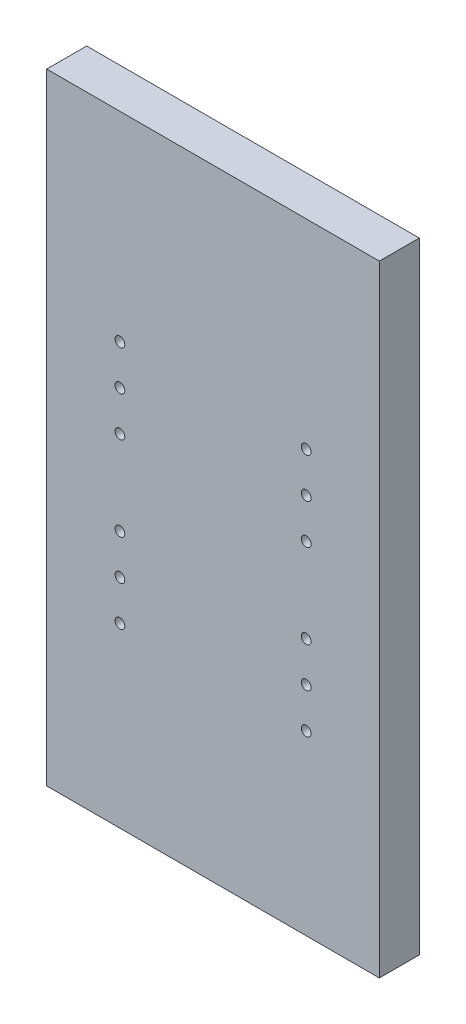
ISO-10303-21;
HEADER;
FILE_DESCRIPTION(('STEP AP214'),'2;1');
FILE_NAME('part.step','',(''),(''),'','','');
FILE_SCHEMA(('AUTOMOTIVE_DESIGN { 1 0 10303 214 1 1 1 1 }'));
ENDSEC;
DATA;
#1=APPLICATION_CONTEXT('core data for automotive mechanical design processes');
#2=APPLICATION_PROTOCOL_DEFINITION('international standard','automotive_design',2000,#1);
#3=PRODUCT_CONTEXT('',#1,'mechanical');
#4=PRODUCT('Part','Part','',(#3));
#5=PRODUCT_RELATED_PRODUCT_CATEGORY('part','',(#4));
#6=PRODUCT_DEFINITION_FORMATION('','',#4);
#7=PRODUCT_DEFINITION_CONTEXT('part definition',#1,'design');
#8=PRODUCT_DEFINITION('design','',#6,#7);
#9=PRODUCT_DEFINITION_SHAPE('','',#8);
#10=(LENGTH_UNIT() NAMED_UNIT(*) SI_UNIT(.MILLI.,.METRE.));
#11=(NAMED_UNIT(*) PLANE_ANGLE_UNIT() SI_UNIT($,.RADIAN.));
#12=(NAMED_UNIT(*) SI_UNIT($,.STERADIAN.) SOLID_ANGLE_UNIT());
#13=UNCERTAINTY_MEASURE_WITH_UNIT(LENGTH_MEASURE(1.E-05),#10,'distance_accuracy_value','');
#14=(GEOMETRIC_REPRESENTATION_CONTEXT(3) GLOBAL_UNCERTAINTY_ASSIGNED_CONTEXT((#13)) GLOBAL_UNIT_ASSIGNED_CONTEXT((#10,
#11,#12)) REPRESENTATION_CONTEXT('',''));
#15=CARTESIAN_POINT('',(0.,0.,0.));
#16=DIRECTION('',(0.,0.,1.));
#17=DIRECTION('',(1.,0.,0.));
#18=AXIS2_PLACEMENT_3D('',#15,#16,#17);
#19=CARTESIAN_POINT('',(0.,0.,18.));
#20=DIRECTION('',(0.,0.,-1.));
#21=DIRECTION('',(-1.,0.,0.));
#22=AXIS2_PLACEMENT_3D('',#19,#20,#21);
#23=PLANE('',#22);
#24=CARTESIAN_POINT('',(263.043137643902,1064.69288200509,18.));
#25=DIRECTION('',(0.,0.,-1.));
#26=DIRECTION('',(-1.,0.,0.));
#27=AXIS2_PLACEMENT_3D('',#24,#25,#26);
#28=CIRCLE('',#27,2.20000000000006);
#29=CARTESIAN_POINT('',(260.843137643902,1064.69288200509,18.));
#30=VERTEX_POINT('',#29);
#31=EDGE_CURVE('E177',#30,#30,#28,.T.);
#32=ORIENTED_EDGE('',*,*,#31,.T.);
#33=EDGE_LOOP('',(#32));
#34=FACE_BOUND('',#33,.T.);
#35=CARTESIAN_POINT('',(263.043137643902,1082.69288200509,18.));
#36=DIRECTION('',(0.,0.,-1.));
#37=DIRECTION('',(-1.,0.,0.));
#38=AXIS2_PLACEMENT_3D('',#35,#36,#37);
#39=CIRCLE('',#38,2.20000000000006);
#40=CARTESIAN_POINT('',(260.843137643902,1082.69288200509,18.));
#41=VERTEX_POINT('',#40);
#42=EDGE_CURVE('E305',#41,#41,#39,.T.);
#43=ORIENTED_EDGE('',*,*,#42,.T.);
#44=EDGE_LOOP('',(#43));
#45=FACE_BOUND('',#44,.T.);
#46=CARTESIAN_POINT('',(179.043137643902,1082.69288200509,18.));
#47=DIRECTION('',(0.,0.,-1.));
#48=DIRECTION('',(-1.,0.,0.));
#49=AXIS2_PLACEMENT_3D('',#46,#47,#48);
#50=CIRCLE('',#49,2.20000000000001);
#51=CARTESIAN_POINT('',(176.843137643902,1082.69288200509,18.));
#52=VERTEX_POINT('',#51);
#53=EDGE_CURVE('E303',#52,#52,#50,.T.);
#54=ORIENTED_EDGE('',*,*,#53,.T.);
#55=EDGE_LOOP('',(#54));
#56=FACE_BOUND('',#55,.T.);
#57=CARTESIAN_POINT('',(179.043137643902,1064.69288200509,18.));
#58=DIRECTION('',(0.,0.,-1.));
#59=DIRECTION('',(-1.,0.,0.));
#60=AXIS2_PLACEMENT_3D('',#57,#58,#59);
#61=CIRCLE('',#60,2.20000000000001);
#62=CARTESIAN_POINT('',(176.843137643902,1064.69288200509,18.));
#63=VERTEX_POINT('',#62);
#64=EDGE_CURVE('E300',#63,#63,#61,.T.);
#65=ORIENTED_EDGE('',*,*,#64,.T.);
#66=EDGE_LOOP('',(#65));
#67=FACE_BOUND('',#66,.T.);
#68=CARTESIAN_POINT('',(179.043137643902,1046.69288200509,18.));
#69=DIRECTION('',(0.,0.,-1.));
#70=DIRECTION('',(-1.,0.,0.));
#71=AXIS2_PLACEMENT_3D('',#68,#69,#70);
#72=CIRCLE('',#71,2.20000000000001);
#73=CARTESIAN_POINT('',(176.843137643902,1046.69288200509,18.));
#74=VERTEX_POINT('',#73);
#75=EDGE_CURVE('E297',#74,#74,#72,.T.);
#76=ORIENTED_EDGE('',*,*,#75,.T.);
#77=EDGE_LOOP('',(#76));
#78=FACE_BOUND('',#77,.T.);
#79=CARTESIAN_POINT('',(179.043137643902,1008.69288200509,18.));
#80=DIRECTION('',(0.,0.,-1.));
#81=DIRECTION('',(-1.,0.,0.));
#82=AXIS2_PLACEMENT_3D('',#79,#80,#81);
#83=CIRCLE('',#82,2.20000000000001);
#84=CARTESIAN_POINT('',(176.843137643902,1008.69288200509,18.));
#85=VERTEX_POINT('',#84);
#86=EDGE_CURVE('E294',#85,#85,#83,.T.);
#87=ORIENTED_EDGE('',*,*,#86,.T.);
#88=EDGE_LOOP('',(#87));
#89=FACE_BOUND('',#88,.T.);
#90=CARTESIAN_POINT('',(179.043137643902,990.692882005094,18.));
#91=DIRECTION('',(0.,0.,-1.));
#92=DIRECTION('',(-1.,0.,0.));
#93=AXIS2_PLACEMENT_3D('',#90,#91,#92);
#94=CIRCLE('',#93,2.19999999999998);
#95=CARTESIAN_POINT('',(176.843137643902,990.692882005094,18.));
#96=VERTEX_POINT('',#95);
#97=EDGE_CURVE('E291',#96,#96,#94,.T.);
#98=ORIENTED_EDGE('',*,*,#97,.T.);
#99=EDGE_LOOP('',(#98));
#100=FACE_BOUND('',#99,.T.);
#101=CARTESIAN_POINT('',(179.043137643902,972.692882005094,18.));
#102=DIRECTION('',(0.,0.,-1.));
#103=DIRECTION('',(-1.,0.,0.));
#104=AXIS2_PLACEMENT_3D('',#101,#102,#103);
#105=CIRCLE('',#104,2.19999999999998);
#106=CARTESIAN_POINT('',(176.843137643902,972.692882005094,18.));
#107=VERTEX_POINT('',#106);
#108=EDGE_CURVE('E288',#107,#107,#105,.T.);
#109=ORIENTED_EDGE('',*,*,#108,.T.);
#110=EDGE_LOOP('',(#109));
#111=FACE_BOUND('',#110,.T.);
#112=CARTESIAN_POINT('',(263.043137643902,972.692882005094,18.));
#113=DIRECTION('',(0.,0.,-1.));
#114=DIRECTION('',(-1.,0.,0.));
#115=AXIS2_PLACEMENT_3D('',#112,#113,#114);
#116=CIRCLE('',#115,2.19999999999998);
#117=CARTESIAN_POINT('',(260.843137643902,972.692882005094,18.));
#118=VERTEX_POINT('',#117);
#119=EDGE_CURVE('E285',#118,#118,#116,.T.);
#120=ORIENTED_EDGE('',*,*,#119,.T.);
#121=EDGE_LOOP('',(#120));
#122=FACE_BOUND('',#121,.T.);
#123=CARTESIAN_POINT('',(263.043137643902,990.692882005094,18.));
#124=DIRECTION('',(0.,0.,-1.));
#125=DIRECTION('',(-1.,0.,0.));
#126=AXIS2_PLACEMENT_3D('',#123,#124,#125);
#127=CIRCLE('',#126,2.19999999999998);
#128=CARTESIAN_POINT('',(260.843137643902,990.692882005094,18.));
#129=VERTEX_POINT('',#128);
#130=EDGE_CURVE('E282',#129,#129,#127,.T.);
#131=ORIENTED_EDGE('',*,*,#130,.T.);
#132=EDGE_LOOP('',(#131));
#133=FACE_BOUND('',#132,.T.);
#134=CARTESIAN_POINT('',(263.043137643902,1008.69288200509,18.));
#135=DIRECTION('',(0.,0.,-1.));
#136=DIRECTION('',(-1.,0.,0.));
#137=AXIS2_PLACEMENT_3D('',#134,#135,#136);
#138=CIRCLE('',#137,2.20000000000001);
#139=CARTESIAN_POINT('',(260.843137643902,1008.69288200509,18.));
#140=VERTEX_POINT('',#139);
#141=EDGE_CURVE('E278',#140,#140,#138,.T.);
#142=ORIENTED_EDGE('',*,*,#141,.T.);
#143=EDGE_LOOP('',(#142));
#144=FACE_BOUND('',#143,.T.);
#145=CARTESIAN_POINT('',(263.043137643902,1046.69288200509,18.));
#146=DIRECTION('',(0.,0.,-1.));
#147=DIRECTION('',(-1.,0.,0.));
#148=AXIS2_PLACEMENT_3D('',#145,#146,#147);
#149=CIRCLE('',#148,2.20000000000006);
#150=CARTESIAN_POINT('',(260.843137643902,1046.69288200509,18.));
#151=VERTEX_POINT('',#150);
#152=EDGE_CURVE('E275',#151,#151,#149,.T.);
#153=ORIENTED_EDGE('',*,*,#152,.T.);
#154=EDGE_LOOP('',(#153));
#155=FACE_BOUND('',#154,.T.);
#156=DIRECTION('',(0.,-1.,0.));
#157=VECTOR('',#156,1.);
#158=CARTESIAN_POINT('',(146.043137643902,1172.69288200509,18.));
#159=LINE('',#158,#157);
#160=CARTESIAN_POINT('',(146.043137643902,1172.69288200509,18.));
#161=VERTEX_POINT('',#160);
#162=CARTESIAN_POINT('',(146.043137643902,892.692882005094,18.));
#163=VERTEX_POINT('',#162);
#164=EDGE_CURVE('E183',#161,#163,#159,.T.);
#165=ORIENTED_EDGE('',*,*,#164,.T.);
#166=DIRECTION('',(1.,0.,0.));
#167=VECTOR('',#166,1.);
#168=CARTESIAN_POINT('',(296.043137643902,892.692882005094,18.));
#169=LINE('',#168,#167);
#170=CARTESIAN_POINT('',(296.043137643902,892.692882005094,18.));
#171=VERTEX_POINT('',#170);
#172=EDGE_CURVE('E229',#163,#171,#169,.T.);
#173=ORIENTED_EDGE('',*,*,#172,.T.);
#174=DIRECTION('',(0.,1.,0.));
#175=VECTOR('',#174,1.);
#176=CARTESIAN_POINT('',(296.043137643902,1172.69288200509,18.));
#177=LINE('',#176,#175);
#178=CARTESIAN_POINT('',(296.043137643902,1172.69288200509,18.));
#179=VERTEX_POINT('',#178);
#180=EDGE_CURVE('E210',#171,#179,#177,.T.);
#181=ORIENTED_EDGE('',*,*,#180,.T.);
#182=DIRECTION('',(-1.,0.,0.));
#183=VECTOR('',#182,1.);
#184=CARTESIAN_POINT('',(296.043137643902,1172.69288200509,18.));
#185=LINE('',#184,#183);
#186=EDGE_CURVE('E204',#179,#161,#185,.T.);
#187=ORIENTED_EDGE('',*,*,#186,.T.);
#188=EDGE_LOOP('',(#165,#173,#181,#187));
#189=FACE_BOUND('',#188,.T.);
#190=ADVANCED_FACE('F174',(#34,#45,#56,#67,#78,#89,#100,#111,#122,#133,#144,#155,#189),#23,.F.);
#191=CARTESIAN_POINT('',(0.,0.,0.));
#192=DIRECTION('',(0.,0.,-1.));
#193=DIRECTION('',(-1.,0.,0.));
#194=AXIS2_PLACEMENT_3D('',#191,#192,#193);
#195=PLANE('',#194);
#196=DIRECTION('',(0.,-1.,0.));
#197=VECTOR('',#196,1.);
#198=CARTESIAN_POINT('',(146.043137643902,1172.69288200509,0.));
#199=LINE('',#198,#197);
#200=CARTESIAN_POINT('',(146.043137643902,1172.69288200509,0.));
#201=VERTEX_POINT('',#200);
#202=CARTESIAN_POINT('',(146.043137643902,892.692882005094,0.));
#203=VERTEX_POINT('',#202);
#204=EDGE_CURVE('E12',#201,#203,#199,.T.);
#205=ORIENTED_EDGE('',*,*,#204,.F.);
#206=DIRECTION('',(-1.,0.,0.));
#207=VECTOR('',#206,1.);
#208=CARTESIAN_POINT('',(296.043137643902,1172.69288200509,0.));
#209=LINE('',#208,#207);
#210=CARTESIAN_POINT('',(296.043137643902,1172.69288200509,0.));
#211=VERTEX_POINT('',#210);
#212=EDGE_CURVE('E236',#211,#201,#209,.T.);
#213=ORIENTED_EDGE('',*,*,#212,.F.);
#214=DIRECTION('',(0.,1.,0.));
#215=VECTOR('',#214,1.);
#216=CARTESIAN_POINT('',(296.043137643902,1172.69288200509,0.));
#217=LINE('',#216,#215);
#218=CARTESIAN_POINT('',(296.043137643902,892.692882005094,0.));
#219=VERTEX_POINT('',#218);
#220=EDGE_CURVE('E221',#219,#211,#217,.T.);
#221=ORIENTED_EDGE('',*,*,#220,.F.);
#222=DIRECTION('',(1.,0.,0.));
#223=VECTOR('',#222,1.);
#224=CARTESIAN_POINT('',(296.043137643902,892.692882005094,0.));
#225=LINE('',#224,#223);
#226=EDGE_CURVE('E217',#203,#219,#225,.T.);
#227=ORIENTED_EDGE('',*,*,#226,.F.);
#228=EDGE_LOOP('',(#205,#213,#221,#227));
#229=FACE_BOUND('',#228,.T.);
#230=ADVANCED_FACE('F219',(#229),#195,.T.);
#231=CARTESIAN_POINT('',(296.043137643902,1172.69288200509,0.));
#232=DIRECTION('',(0.,1.,0.));
#233=DIRECTION('',(-1.,0.,0.));
#234=AXIS2_PLACEMENT_3D('',#231,#232,#233);
#235=PLANE('',#234);
#236=ORIENTED_EDGE('',*,*,#186,.F.);
#237=DIRECTION('',(0.,0.,1.));
#238=VECTOR('',#237,1.);
#239=CARTESIAN_POINT('',(296.043137643902,1172.69288200509,0.));
#240=LINE('',#239,#238);
#241=EDGE_CURVE('E240',#211,#179,#240,.T.);
#242=ORIENTED_EDGE('',*,*,#241,.F.);
#243=ORIENTED_EDGE('',*,*,#212,.T.);
#244=DIRECTION('',(0.,0.,1.));
#245=VECTOR('',#244,1.);
#246=CARTESIAN_POINT('',(146.043137643902,1172.69288200509,0.));
#247=LINE('',#246,#245);
#248=EDGE_CURVE('E233',#201,#161,#247,.T.);
#249=ORIENTED_EDGE('',*,*,#248,.T.);
#250=EDGE_LOOP('',(#236,#242,#243,#249));
#251=FACE_BOUND('',#250,.T.);
#252=ADVANCED_FACE('F239',(#251),#235,.T.);
#253=CARTESIAN_POINT('',(296.043137643902,1172.69288200509,0.));
#254=DIRECTION('',(1.,0.,0.));
#255=DIRECTION('',(0.,0.,-1.));
#256=AXIS2_PLACEMENT_3D('',#253,#254,#255);
#257=PLANE('',#256);
#258=ORIENTED_EDGE('',*,*,#180,.F.);
#259=DIRECTION('',(0.,0.,1.));
#260=VECTOR('',#259,1.);
#261=CARTESIAN_POINT('',(296.043137643902,892.692882005094,0.));
#262=LINE('',#261,#260);
#263=EDGE_CURVE('E263',#219,#171,#262,.T.);
#264=ORIENTED_EDGE('',*,*,#263,.F.);
#265=ORIENTED_EDGE('',*,*,#220,.T.);
#266=ORIENTED_EDGE('',*,*,#241,.T.);
#267=EDGE_LOOP('',(#258,#264,#265,#266));
#268=FACE_BOUND('',#267,.T.);
#269=ADVANCED_FACE('F340',(#268),#257,.T.);
#270=CARTESIAN_POINT('',(296.043137643902,892.692882005094,0.));
#271=DIRECTION('',(0.,-1.,0.));
#272=DIRECTION('',(1.,0.,0.));
#273=AXIS2_PLACEMENT_3D('',#270,#271,#272);
#274=PLANE('',#273);
#275=ORIENTED_EDGE('',*,*,#172,.F.);
#276=DIRECTION('',(0.,0.,1.));
#277=VECTOR('',#276,1.);
#278=CARTESIAN_POINT('',(146.043137643902,892.692882005094,0.));
#279=LINE('',#278,#277);
#280=EDGE_CURVE('E225',#203,#163,#279,.T.);
#281=ORIENTED_EDGE('',*,*,#280,.F.);
#282=ORIENTED_EDGE('',*,*,#226,.T.);
#283=ORIENTED_EDGE('',*,*,#263,.T.);
#284=EDGE_LOOP('',(#275,#281,#282,#283));
#285=FACE_BOUND('',#284,.T.);
#286=ADVANCED_FACE('F228',(#285),#274,.T.);
#287=CARTESIAN_POINT('',(146.043137643902,1172.69288200509,0.));
#288=DIRECTION('',(-1.,0.,0.));
#289=DIRECTION('',(0.,0.,1.));
#290=AXIS2_PLACEMENT_3D('',#287,#288,#289);
#291=PLANE('',#290);
#292=ORIENTED_EDGE('',*,*,#164,.F.);
#293=ORIENTED_EDGE('',*,*,#248,.F.);
#294=ORIENTED_EDGE('',*,*,#204,.T.);
#295=ORIENTED_EDGE('',*,*,#280,.T.);
#296=EDGE_LOOP('',(#292,#293,#294,#295));
#297=FACE_BOUND('',#296,.T.);
#298=ADVANCED_FACE('F232',(#297),#291,.T.);
#299=CARTESIAN_POINT('',(263.043137643902,1046.69288200509,20.9999999999988));
#300=DIRECTION('',(0.,0.,-1.));
#301=DIRECTION('',(-1.,0.,0.));
#302=AXIS2_PLACEMENT_3D('',#299,#300,#301);
#303=CYLINDRICAL_SURFACE('',#302,2.20000000000006);
#304=CARTESIAN_POINT('',(263.043137643902,1046.69288200509,2.9999999999988));
#305=DIRECTION('',(0.,0.,-1.));
#306=DIRECTION('',(-1.,0.,0.));
#307=AXIS2_PLACEMENT_3D('',#304,#305,#306);
#308=CIRCLE('',#307,2.20000000000006);
#309=CARTESIAN_POINT('',(260.843137643902,1046.69288200509,2.9999999999988));
#310=VERTEX_POINT('',#309);
#311=EDGE_CURVE('E279',#310,#310,#308,.T.);
#312=ORIENTED_EDGE('',*,*,#311,.T.);
#313=EDGE_LOOP('',(#312));
#314=FACE_BOUND('',#313,.T.);
#315=ORIENTED_EDGE('',*,*,#152,.F.);
#316=EDGE_LOOP('',(#315));
#317=FACE_BOUND('',#316,.T.);
#318=ADVANCED_FACE('F331',(#314,#317),#303,.F.);
#319=CARTESIAN_POINT('',(0.,0.,2.99999999999881));
#320=DIRECTION('',(0.,0.,-1.));
#321=DIRECTION('',(-1.,0.,0.));
#322=AXIS2_PLACEMENT_3D('',#319,#320,#321);
#323=PLANE('',#322);
#324=ORIENTED_EDGE('',*,*,#311,.F.);
#325=EDGE_LOOP('',(#324));
#326=FACE_BOUND('',#325,.T.);
#327=ADVANCED_FACE('F337',(#326),#323,.F.);
#328=CARTESIAN_POINT('',(263.043137643902,1008.69288200509,20.9999999999988));
#329=DIRECTION('',(0.,0.,-1.));
#330=DIRECTION('',(-1.,0.,0.));
#331=AXIS2_PLACEMENT_3D('',#328,#329,#330);
#332=CYLINDRICAL_SURFACE('',#331,2.20000000000001);
#333=CARTESIAN_POINT('',(263.043137643902,1008.69288200509,2.9999999999988));
#334=DIRECTION('',(0.,0.,-1.));
#335=DIRECTION('',(-1.,0.,0.));
#336=AXIS2_PLACEMENT_3D('',#333,#334,#335);
#337=CIRCLE('',#336,2.20000000000001);
#338=CARTESIAN_POINT('',(260.843137643902,1008.69288200509,2.9999999999988));
#339=VERTEX_POINT('',#338);
#340=EDGE_CURVE('E641',#339,#339,#337,.T.);
#341=ORIENTED_EDGE('',*,*,#340,.T.);
#342=EDGE_LOOP('',(#341));
#343=FACE_BOUND('',#342,.T.);
#344=ORIENTED_EDGE('',*,*,#141,.F.);
#345=EDGE_LOOP('',(#344));
#346=FACE_BOUND('',#345,.T.);
#347=ADVANCED_FACE('F370',(#343,#346),#332,.F.);
#348=CARTESIAN_POINT('',(0.,0.,2.99999999999881));
#349=DIRECTION('',(0.,0.,-1.));
#350=DIRECTION('',(-1.,0.,0.));
#351=AXIS2_PLACEMENT_3D('',#348,#349,#350);
#352=PLANE('',#351);
#353=ORIENTED_EDGE('',*,*,#340,.F.);
#354=EDGE_LOOP('',(#353));
#355=FACE_BOUND('',#354,.T.);
#356=ADVANCED_FACE('F380',(#355),#352,.F.);
#357=CARTESIAN_POINT('',(263.043137643902,990.692882005094,20.9999999999988));
#358=DIRECTION('',(0.,0.,-1.));
#359=DIRECTION('',(-1.,0.,0.));
#360=AXIS2_PLACEMENT_3D('',#357,#358,#359);
#361=CYLINDRICAL_SURFACE('',#360,2.19999999999998);
#362=CARTESIAN_POINT('',(263.043137643902,990.692882005094,2.9999999999988));
#363=DIRECTION('',(0.,0.,-1.));
#364=DIRECTION('',(-1.,0.,0.));
#365=AXIS2_PLACEMENT_3D('',#362,#363,#364);
#366=CIRCLE('',#365,2.19999999999998);
#367=CARTESIAN_POINT('',(260.843137643902,990.692882005094,2.9999999999988));
#368=VERTEX_POINT('',#367);
#369=EDGE_CURVE('E637',#368,#368,#366,.T.);
#370=ORIENTED_EDGE('',*,*,#369,.T.);
#371=EDGE_LOOP('',(#370));
#372=FACE_BOUND('',#371,.T.);
#373=ORIENTED_EDGE('',*,*,#130,.F.);
#374=EDGE_LOOP('',(#373));
#375=FACE_BOUND('',#374,.T.);
#376=ADVANCED_FACE('F390',(#372,#375),#361,.F.);
#377=CARTESIAN_POINT('',(0.,0.,2.99999999999881));
#378=DIRECTION('',(0.,0.,-1.));
#379=DIRECTION('',(-1.,0.,0.));
#380=AXIS2_PLACEMENT_3D('',#377,#378,#379);
#381=PLANE('',#380);
#382=ORIENTED_EDGE('',*,*,#369,.F.);
#383=EDGE_LOOP('',(#382));
#384=FACE_BOUND('',#383,.T.);
#385=ADVANCED_FACE('F399',(#384),#381,.F.);
#386=CARTESIAN_POINT('',(263.043137643902,972.692882005094,20.9999999999988));
#387=DIRECTION('',(0.,0.,-1.));
#388=DIRECTION('',(-1.,0.,0.));
#389=AXIS2_PLACEMENT_3D('',#386,#387,#388);
#390=CYLINDRICAL_SURFACE('',#389,2.19999999999998);
#391=CARTESIAN_POINT('',(263.043137643902,972.692882005094,2.9999999999988));
#392=DIRECTION('',(0.,0.,-1.));
#393=DIRECTION('',(-1.,0.,0.));
#394=AXIS2_PLACEMENT_3D('',#391,#392,#393);
#395=CIRCLE('',#394,2.19999999999998);
#396=CARTESIAN_POINT('',(260.843137643902,972.692882005094,2.9999999999988));
#397=VERTEX_POINT('',#396);
#398=EDGE_CURVE('E629',#397,#397,#395,.T.);
#399=ORIENTED_EDGE('',*,*,#398,.T.);
#400=EDGE_LOOP('',(#399));
#401=FACE_BOUND('',#400,.T.);
#402=ORIENTED_EDGE('',*,*,#119,.F.);
#403=EDGE_LOOP('',(#402));
#404=FACE_BOUND('',#403,.T.);
#405=ADVANCED_FACE('F409',(#401,#404),#390,.F.);
#406=CARTESIAN_POINT('',(0.,0.,2.99999999999881));
#407=DIRECTION('',(0.,0.,-1.));
#408=DIRECTION('',(-1.,0.,0.));
#409=AXIS2_PLACEMENT_3D('',#406,#407,#408);
#410=PLANE('',#409);
#411=ORIENTED_EDGE('',*,*,#398,.F.);
#412=EDGE_LOOP('',(#411));
#413=FACE_BOUND('',#412,.T.);
#414=ADVANCED_FACE('F419',(#413),#410,.F.);
#415=CARTESIAN_POINT('',(179.043137643902,972.692882005094,20.9999999999988));
#416=DIRECTION('',(0.,0.,-1.));
#417=DIRECTION('',(-1.,0.,0.));
#418=AXIS2_PLACEMENT_3D('',#415,#416,#417);
#419=CYLINDRICAL_SURFACE('',#418,2.19999999999998);
#420=CARTESIAN_POINT('',(179.043137643902,972.692882005094,2.9999999999988));
#421=DIRECTION('',(0.,0.,-1.));
#422=DIRECTION('',(-1.,0.,0.));
#423=AXIS2_PLACEMENT_3D('',#420,#421,#422);
#424=CIRCLE('',#423,2.19999999999998);
#425=CARTESIAN_POINT('',(176.843137643902,972.692882005094,2.9999999999988));
#426=VERTEX_POINT('',#425);
#427=EDGE_CURVE('E626',#426,#426,#424,.T.);
#428=ORIENTED_EDGE('',*,*,#427,.T.);
#429=EDGE_LOOP('',(#428));
#430=FACE_BOUND('',#429,.T.);
#431=ORIENTED_EDGE('',*,*,#108,.F.);
#432=EDGE_LOOP('',(#431));
#433=FACE_BOUND('',#432,.T.);
#434=ADVANCED_FACE('F429',(#430,#433),#419,.F.);
#435=CARTESIAN_POINT('',(0.,0.,2.99999999999881));
#436=DIRECTION('',(0.,0.,-1.));
#437=DIRECTION('',(-1.,0.,0.));
#438=AXIS2_PLACEMENT_3D('',#435,#436,#437);
#439=PLANE('',#438);
#440=ORIENTED_EDGE('',*,*,#427,.F.);
#441=EDGE_LOOP('',(#440));
#442=FACE_BOUND('',#441,.T.);
#443=ADVANCED_FACE('F439',(#442),#439,.F.);
#444=CARTESIAN_POINT('',(179.043137643902,990.692882005094,20.9999999999988));
#445=DIRECTION('',(0.,0.,-1.));
#446=DIRECTION('',(-1.,0.,0.));
#447=AXIS2_PLACEMENT_3D('',#444,#445,#446);
#448=CYLINDRICAL_SURFACE('',#447,2.19999999999998);
#449=CARTESIAN_POINT('',(179.043137643902,990.692882005094,2.9999999999988));
#450=DIRECTION('',(0.,0.,-1.));
#451=DIRECTION('',(-1.,0.,0.));
#452=AXIS2_PLACEMENT_3D('',#449,#450,#451);
#453=CIRCLE('',#452,2.19999999999998);
#454=CARTESIAN_POINT('',(176.843137643902,990.692882005094,2.9999999999988));
#455=VERTEX_POINT('',#454);
#456=EDGE_CURVE('E623',#455,#455,#453,.T.);
#457=ORIENTED_EDGE('',*,*,#456,.T.);
#458=EDGE_LOOP('',(#457));
#459=FACE_BOUND('',#458,.T.);
#460=ORIENTED_EDGE('',*,*,#97,.F.);
#461=EDGE_LOOP('',(#460));
#462=FACE_BOUND('',#461,.T.);
#463=ADVANCED_FACE('F449',(#459,#462),#448,.F.);
#464=CARTESIAN_POINT('',(0.,0.,2.99999999999881));
#465=DIRECTION('',(0.,0.,-1.));
#466=DIRECTION('',(-1.,0.,0.));
#467=AXIS2_PLACEMENT_3D('',#464,#465,#466);
#468=PLANE('',#467);
#469=ORIENTED_EDGE('',*,*,#456,.F.);
#470=EDGE_LOOP('',(#469));
#471=FACE_BOUND('',#470,.T.);
#472=ADVANCED_FACE('F459',(#471),#468,.F.);
#473=CARTESIAN_POINT('',(179.043137643902,1008.69288200509,20.9999999999988));
#474=DIRECTION('',(0.,0.,-1.));
#475=DIRECTION('',(-1.,0.,0.));
#476=AXIS2_PLACEMENT_3D('',#473,#474,#475);
#477=CYLINDRICAL_SURFACE('',#476,2.20000000000001);
#478=CARTESIAN_POINT('',(179.043137643902,1008.69288200509,2.9999999999988));
#479=DIRECTION('',(0.,0.,-1.));
#480=DIRECTION('',(-1.,0.,0.));
#481=AXIS2_PLACEMENT_3D('',#478,#479,#480);
#482=CIRCLE('',#481,2.20000000000001);
#483=CARTESIAN_POINT('',(176.843137643902,1008.69288200509,2.9999999999988));
#484=VERTEX_POINT('',#483);
#485=EDGE_CURVE('E620',#484,#484,#482,.T.);
#486=ORIENTED_EDGE('',*,*,#485,.T.);
#487=EDGE_LOOP('',(#486));
#488=FACE_BOUND('',#487,.T.);
#489=ORIENTED_EDGE('',*,*,#86,.F.);
#490=EDGE_LOOP('',(#489));
#491=FACE_BOUND('',#490,.T.);
#492=ADVANCED_FACE('F469',(#488,#491),#477,.F.);
#493=CARTESIAN_POINT('',(0.,0.,2.99999999999881));
#494=DIRECTION('',(0.,0.,-1.));
#495=DIRECTION('',(-1.,0.,0.));
#496=AXIS2_PLACEMENT_3D('',#493,#494,#495);
#497=PLANE('',#496);
#498=ORIENTED_EDGE('',*,*,#485,.F.);
#499=EDGE_LOOP('',(#498));
#500=FACE_BOUND('',#499,.T.);
#501=ADVANCED_FACE('F479',(#500),#497,.F.);
#502=CARTESIAN_POINT('',(179.043137643902,1046.69288200509,20.9999999999988));
#503=DIRECTION('',(0.,0.,-1.));
#504=DIRECTION('',(-1.,0.,0.));
#505=AXIS2_PLACEMENT_3D('',#502,#503,#504);
#506=CYLINDRICAL_SURFACE('',#505,2.20000000000001);
#507=CARTESIAN_POINT('',(179.043137643902,1046.69288200509,2.9999999999988));
#508=DIRECTION('',(0.,0.,-1.));
#509=DIRECTION('',(-1.,0.,0.));
#510=AXIS2_PLACEMENT_3D('',#507,#508,#509);
#511=CIRCLE('',#510,2.20000000000001);
#512=CARTESIAN_POINT('',(176.843137643902,1046.69288200509,2.9999999999988));
#513=VERTEX_POINT('',#512);
#514=EDGE_CURVE('E617',#513,#513,#511,.T.);
#515=ORIENTED_EDGE('',*,*,#514,.T.);
#516=EDGE_LOOP('',(#515));
#517=FACE_BOUND('',#516,.T.);
#518=ORIENTED_EDGE('',*,*,#75,.F.);
#519=EDGE_LOOP('',(#518));
#520=FACE_BOUND('',#519,.T.);
#521=ADVANCED_FACE('F489',(#517,#520),#506,.F.);
#522=CARTESIAN_POINT('',(0.,0.,2.99999999999881));
#523=DIRECTION('',(0.,0.,-1.));
#524=DIRECTION('',(-1.,0.,0.));
#525=AXIS2_PLACEMENT_3D('',#522,#523,#524);
#526=PLANE('',#525);
#527=ORIENTED_EDGE('',*,*,#514,.F.);
#528=EDGE_LOOP('',(#527));
#529=FACE_BOUND('',#528,.T.);
#530=ADVANCED_FACE('F499',(#529),#526,.F.);
#531=CARTESIAN_POINT('',(179.043137643902,1064.69288200509,20.9999999999988));
#532=DIRECTION('',(0.,0.,-1.));
#533=DIRECTION('',(-1.,0.,0.));
#534=AXIS2_PLACEMENT_3D('',#531,#532,#533);
#535=CYLINDRICAL_SURFACE('',#534,2.20000000000001);
#536=CARTESIAN_POINT('',(179.043137643902,1064.69288200509,2.9999999999988));
#537=DIRECTION('',(0.,0.,-1.));
#538=DIRECTION('',(-1.,0.,0.));
#539=AXIS2_PLACEMENT_3D('',#536,#537,#538);
#540=CIRCLE('',#539,2.20000000000001);
#541=CARTESIAN_POINT('',(176.843137643902,1064.69288200509,2.9999999999988));
#542=VERTEX_POINT('',#541);
#543=EDGE_CURVE('E611',#542,#542,#540,.T.);
#544=ORIENTED_EDGE('',*,*,#543,.T.);
#545=EDGE_LOOP('',(#544));
#546=FACE_BOUND('',#545,.T.);
#547=ORIENTED_EDGE('',*,*,#64,.F.);
#548=EDGE_LOOP('',(#547));
#549=FACE_BOUND('',#548,.T.);
#550=ADVANCED_FACE('F509',(#546,#549),#535,.F.);
#551=CARTESIAN_POINT('',(0.,0.,2.99999999999881));
#552=DIRECTION('',(0.,0.,-1.));
#553=DIRECTION('',(-1.,0.,0.));
#554=AXIS2_PLACEMENT_3D('',#551,#552,#553);
#555=PLANE('',#554);
#556=ORIENTED_EDGE('',*,*,#543,.F.);
#557=EDGE_LOOP('',(#556));
#558=FACE_BOUND('',#557,.T.);
#559=ADVANCED_FACE('F519',(#558),#555,.F.);
#560=CARTESIAN_POINT('',(179.043137643902,1082.69288200509,20.9999999999988));
#561=DIRECTION('',(0.,0.,-1.));
#562=DIRECTION('',(-1.,0.,0.));
#563=AXIS2_PLACEMENT_3D('',#560,#561,#562);
#564=CYLINDRICAL_SURFACE('',#563,2.20000000000001);
#565=CARTESIAN_POINT('',(179.043137643902,1082.69288200509,2.9999999999988));
#566=DIRECTION('',(0.,0.,-1.));
#567=DIRECTION('',(-1.,0.,0.));
#568=AXIS2_PLACEMENT_3D('',#565,#566,#567);
#569=CIRCLE('',#568,2.20000000000001);
#570=CARTESIAN_POINT('',(176.843137643902,1082.69288200509,2.9999999999988));
#571=VERTEX_POINT('',#570);
#572=EDGE_CURVE('E607',#571,#571,#569,.T.);
#573=ORIENTED_EDGE('',*,*,#572,.T.);
#574=EDGE_LOOP('',(#573));
#575=FACE_BOUND('',#574,.T.);
#576=ORIENTED_EDGE('',*,*,#53,.F.);
#577=EDGE_LOOP('',(#576));
#578=FACE_BOUND('',#577,.T.);
#579=ADVANCED_FACE('F529',(#575,#578),#564,.F.);
#580=CARTESIAN_POINT('',(0.,0.,2.99999999999881));
#581=DIRECTION('',(0.,0.,-1.));
#582=DIRECTION('',(-1.,0.,0.));
#583=AXIS2_PLACEMENT_3D('',#580,#581,#582);
#584=PLANE('',#583);
#585=ORIENTED_EDGE('',*,*,#572,.F.);
#586=EDGE_LOOP('',(#585));
#587=FACE_BOUND('',#586,.T.);
#588=ADVANCED_FACE('F539',(#587),#584,.F.);
#589=CARTESIAN_POINT('',(263.043137643902,1082.69288200509,20.9999999999988));
#590=DIRECTION('',(0.,0.,-1.));
#591=DIRECTION('',(-1.,0.,0.));
#592=AXIS2_PLACEMENT_3D('',#589,#590,#591);
#593=CYLINDRICAL_SURFACE('',#592,2.20000000000006);
#594=CARTESIAN_POINT('',(263.043137643902,1082.69288200509,2.9999999999988));
#595=DIRECTION('',(0.,0.,-1.));
#596=DIRECTION('',(-1.,0.,0.));
#597=AXIS2_PLACEMENT_3D('',#594,#595,#596);
#598=CIRCLE('',#597,2.20000000000006);
#599=CARTESIAN_POINT('',(260.843137643902,1082.69288200509,2.9999999999988));
#600=VERTEX_POINT('',#599);
#601=EDGE_CURVE('E605',#600,#600,#598,.T.);
#602=ORIENTED_EDGE('',*,*,#601,.T.);
#603=EDGE_LOOP('',(#602));
#604=FACE_BOUND('',#603,.T.);
#605=ORIENTED_EDGE('',*,*,#42,.F.);
#606=EDGE_LOOP('',(#605));
#607=FACE_BOUND('',#606,.T.);
#608=ADVANCED_FACE('F325',(#604,#607),#593,.F.);
#609=CARTESIAN_POINT('',(0.,0.,2.99999999999881));
#610=DIRECTION('',(0.,0.,-1.));
#611=DIRECTION('',(-1.,0.,0.));
#612=AXIS2_PLACEMENT_3D('',#609,#610,#611);
#613=PLANE('',#612);
#614=ORIENTED_EDGE('',*,*,#601,.F.);
#615=EDGE_LOOP('',(#614));
#616=FACE_BOUND('',#615,.T.);
#617=ADVANCED_FACE('F316',(#616),#613,.F.);
#618=CARTESIAN_POINT('',(263.043137643902,1064.69288200509,20.9999999999988));
#619=DIRECTION('',(0.,0.,-1.));
#620=DIRECTION('',(-1.,0.,0.));
#621=AXIS2_PLACEMENT_3D('',#618,#619,#620);
#622=CYLINDRICAL_SURFACE('',#621,2.20000000000006);
#623=CARTESIAN_POINT('',(263.043137643902,1064.69288200509,2.9999999999988));
#624=DIRECTION('',(0.,0.,-1.));
#625=DIRECTION('',(-1.,0.,0.));
#626=AXIS2_PLACEMENT_3D('',#623,#624,#625);
#627=CIRCLE('',#626,2.20000000000006);
#628=CARTESIAN_POINT('',(260.843137643902,1064.69288200509,2.9999999999988));
#629=VERTEX_POINT('',#628);
#630=EDGE_CURVE('E606',#629,#629,#627,.T.);
#631=ORIENTED_EDGE('',*,*,#630,.T.);
#632=EDGE_LOOP('',(#631));
#633=FACE_BOUND('',#632,.T.);
#634=ORIENTED_EDGE('',*,*,#31,.F.);
#635=EDGE_LOOP('',(#634));
#636=FACE_BOUND('',#635,.T.);
#637=ADVANCED_FACE('F313',(#633,#636),#622,.F.);
#638=CARTESIAN_POINT('',(0.,0.,2.99999999999881));
#639=DIRECTION('',(0.,0.,-1.));
#640=DIRECTION('',(-1.,0.,0.));
#641=AXIS2_PLACEMENT_3D('',#638,#639,#640);
#642=PLANE('',#641);
#643=ORIENTED_EDGE('',*,*,#630,.F.);
#644=EDGE_LOOP('',(#643));
#645=FACE_BOUND('',#644,.T.);
#646=ADVANCED_FACE('F315',(#645),#642,.F.);
#647=CLOSED_SHELL('',(#190,#230,#252,#269,#286,#298,#318,#327,#347,#356,#376,#385,#405,#414,
#434,#443,#463,#472,#492,#501,#521,#530,#550,#559,#579,#588,#608,#617,#637,#646));
#648=MANIFOLD_SOLID_BREP('B2',#647);
#649=ADVANCED_BREP_SHAPE_REPRESENTATION('',(#18,#648),#14);
#650=SHAPE_DEFINITION_REPRESENTATION(#9,#649);
ENDSEC;
END-ISO-10303-21;
